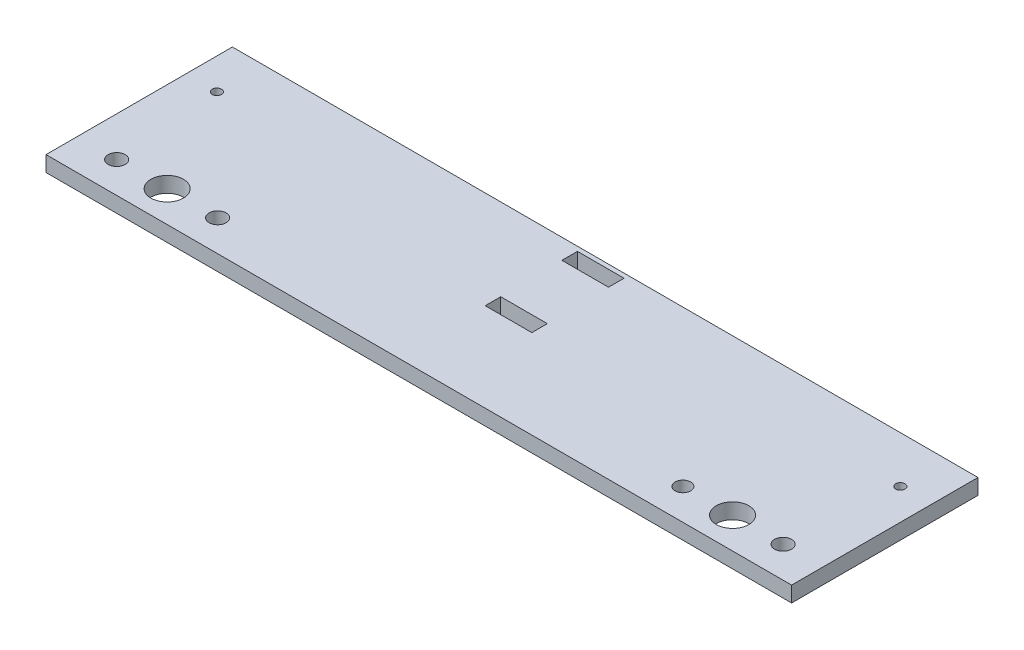
ISO-10303-21;
HEADER;
FILE_DESCRIPTION(('STEP AP214'),'2;1');
FILE_NAME('part.step','',(''),(''),'','','');
FILE_SCHEMA(('AUTOMOTIVE_DESIGN { 1 0 10303 214 1 1 1 1 }'));
ENDSEC;
DATA;
#1=APPLICATION_CONTEXT('core data for automotive mechanical design processes');
#2=APPLICATION_PROTOCOL_DEFINITION('international standard','automotive_design',2000,#1);
#3=PRODUCT_CONTEXT('',#1,'mechanical');
#4=PRODUCT('Part','Part','',(#3));
#5=PRODUCT_RELATED_PRODUCT_CATEGORY('part','',(#4));
#6=PRODUCT_DEFINITION_FORMATION('','',#4);
#7=PRODUCT_DEFINITION_CONTEXT('part definition',#1,'design');
#8=PRODUCT_DEFINITION('design','',#6,#7);
#9=PRODUCT_DEFINITION_SHAPE('','',#8);
#10=(LENGTH_UNIT() NAMED_UNIT(*) SI_UNIT(.MILLI.,.METRE.));
#11=(NAMED_UNIT(*) PLANE_ANGLE_UNIT() SI_UNIT($,.RADIAN.));
#12=(NAMED_UNIT(*) SI_UNIT($,.STERADIAN.) SOLID_ANGLE_UNIT());
#13=UNCERTAINTY_MEASURE_WITH_UNIT(LENGTH_MEASURE(1.E-05),#10,'distance_accuracy_value','');
#14=(GEOMETRIC_REPRESENTATION_CONTEXT(3) GLOBAL_UNCERTAINTY_ASSIGNED_CONTEXT((#13)) GLOBAL_UNIT_ASSIGNED_CONTEXT((#10,
#11,#12)) REPRESENTATION_CONTEXT('',''));
#15=CARTESIAN_POINT('',(0.,0.,0.));
#16=DIRECTION('',(0.,0.,1.));
#17=DIRECTION('',(1.,0.,0.));
#18=AXIS2_PLACEMENT_3D('',#15,#16,#17);
#19=CARTESIAN_POINT('',(0.,5.,0.));
#20=DIRECTION('',(0.,-1.,0.));
#21=DIRECTION('',(0.,0.,-1.));
#22=AXIS2_PLACEMENT_3D('',#19,#20,#21);
#23=PLANE('',#22);
#24=DIRECTION('',(0.,0.,1.));
#25=VECTOR('',#24,1.);
#26=CARTESIAN_POINT('',(-7.49999999999999,5.,-8.3520943961364));
#27=LINE('',#26,#25);
#28=CARTESIAN_POINT('',(-7.49999999999999,5.,-13.3520943961364));
#29=VERTEX_POINT('',#28);
#30=CARTESIAN_POINT('',(-7.49999999999999,5.,-8.3520943961364));
#31=VERTEX_POINT('',#30);
#32=EDGE_CURVE('E161',#29,#31,#27,.T.);
#33=ORIENTED_EDGE('',*,*,#32,.F.);
#34=DIRECTION('',(-1.,0.,0.));
#35=VECTOR('',#34,1.);
#36=CARTESIAN_POINT('',(-7.49999999999999,5.,-13.3520943961364));
#37=LINE('',#36,#35);
#38=CARTESIAN_POINT('',(7.50000000000002,5.,-13.3520943961364));
#39=VERTEX_POINT('',#38);
#40=EDGE_CURVE('E169',#39,#29,#37,.T.);
#41=ORIENTED_EDGE('',*,*,#40,.F.);
#42=DIRECTION('',(0.,0.,-1.));
#43=VECTOR('',#42,1.);
#44=CARTESIAN_POINT('',(7.50000000000003,5.,-8.3520943961364));
#45=LINE('',#44,#43);
#46=CARTESIAN_POINT('',(7.50000000000003,5.,-8.3520943961364));
#47=VERTEX_POINT('',#46);
#48=EDGE_CURVE('E166',#47,#39,#45,.T.);
#49=ORIENTED_EDGE('',*,*,#48,.F.);
#50=DIRECTION('',(1.,0.,0.));
#51=VECTOR('',#50,1.);
#52=CARTESIAN_POINT('',(-7.49999999999999,5.,-8.3520943961364));
#53=LINE('',#52,#51);
#54=EDGE_CURVE('E163',#31,#47,#53,.T.);
#55=ORIENTED_EDGE('',*,*,#54,.F.);
#56=EDGE_LOOP('',(#33,#41,#49,#55));
#57=FACE_BOUND('',#56,.T.);
#58=DIRECTION('',(0.,0.,-1.));
#59=VECTOR('',#58,1.);
#60=CARTESIAN_POINT('',(120.,5.,45.2146363217798));
#61=LINE('',#60,#59);
#62=CARTESIAN_POINT('',(120.,5.,45.2146363217798));
#63=VERTEX_POINT('',#62);
#64=CARTESIAN_POINT('',(120.,5.,-14.7853636782202));
#65=VERTEX_POINT('',#64);
#66=EDGE_CURVE('E204',#63,#65,#61,.T.);
#67=ORIENTED_EDGE('',*,*,#66,.T.);
#68=DIRECTION('',(-1.,0.,0.));
#69=VECTOR('',#68,1.);
#70=CARTESIAN_POINT('',(-120.,5.,-14.7853636782202));
#71=LINE('',#70,#69);
#72=CARTESIAN_POINT('',(-120.,5.,-14.7853636782202));
#73=VERTEX_POINT('',#72);
#74=EDGE_CURVE('E207',#65,#73,#71,.T.);
#75=ORIENTED_EDGE('',*,*,#74,.T.);
#76=DIRECTION('',(0.,0.,1.));
#77=VECTOR('',#76,1.);
#78=CARTESIAN_POINT('',(-120.,5.,45.2146363217798));
#79=LINE('',#78,#77);
#80=CARTESIAN_POINT('',(-120.,5.,45.2146363217798));
#81=VERTEX_POINT('',#80);
#82=EDGE_CURVE('E210',#73,#81,#79,.T.);
#83=ORIENTED_EDGE('',*,*,#82,.T.);
#84=DIRECTION('',(1.,0.,0.));
#85=VECTOR('',#84,1.);
#86=CARTESIAN_POINT('',(-120.,5.,45.2146363217798));
#87=LINE('',#86,#85);
#88=EDGE_CURVE('E212',#81,#63,#87,.T.);
#89=ORIENTED_EDGE('',*,*,#88,.T.);
#90=EDGE_LOOP('',(#67,#75,#83,#89));
#91=FACE_BOUND('',#90,.T.);
#92=CARTESIAN_POINT('',(-91.,5.,35.2146363217798));
#93=DIRECTION('',(0.,1.,0.));
#94=DIRECTION('',(0.,0.,1.));
#95=AXIS2_PLACEMENT_3D('',#92,#93,#94);
#96=CIRCLE('',#95,5.24824810373758);
#97=CARTESIAN_POINT('',(-91.,5.,40.4628844255174));
#98=VERTEX_POINT('',#97);
#99=EDGE_CURVE('E198',#98,#98,#96,.T.);
#100=ORIENTED_EDGE('',*,*,#99,.F.);
#101=EDGE_LOOP('',(#100));
#102=FACE_BOUND('',#101,.T.);
#103=CARTESIAN_POINT('',(91.,5.,35.2146363217798));
#104=DIRECTION('',(0.,1.,0.));
#105=DIRECTION('',(0.,0.,-1.));
#106=AXIS2_PLACEMENT_3D('',#103,#104,#105);
#107=CIRCLE('',#106,5.24824810373758);
#108=CARTESIAN_POINT('',(91.,5.,29.9663882180422));
#109=VERTEX_POINT('',#108);
#110=EDGE_CURVE('E192',#109,#109,#107,.T.);
#111=ORIENTED_EDGE('',*,*,#110,.F.);
#112=EDGE_LOOP('',(#111));
#113=FACE_BOUND('',#112,.T.);
#114=DIRECTION('',(0.,0.,1.));
#115=VECTOR('',#114,1.);
#116=CARTESIAN_POINT('',(-7.18930836329239,5.,16.6479056038636));
#117=LINE('',#116,#115);
#118=CARTESIAN_POINT('',(-7.18930836329239,5.,11.6479056038636));
#119=VERTEX_POINT('',#118);
#120=CARTESIAN_POINT('',(-7.18930836329239,5.,16.6479056038636));
#121=VERTEX_POINT('',#120);
#122=EDGE_CURVE('E122',#119,#121,#117,.T.);
#123=ORIENTED_EDGE('',*,*,#122,.F.);
#124=DIRECTION('',(-1.,0.,0.));
#125=VECTOR('',#124,1.);
#126=CARTESIAN_POINT('',(-7.18930836329239,5.,11.6479056038636));
#127=LINE('',#126,#125);
#128=CARTESIAN_POINT('',(7.81069163670761,5.,11.6479056038636));
#129=VERTEX_POINT('',#128);
#130=EDGE_CURVE('E145',#129,#119,#127,.T.);
#131=ORIENTED_EDGE('',*,*,#130,.F.);
#132=DIRECTION('',(0.,0.,-1.));
#133=VECTOR('',#132,1.);
#134=CARTESIAN_POINT('',(7.81069163670761,5.,16.6479056038636));
#135=LINE('',#134,#133);
#136=CARTESIAN_POINT('',(7.81069163670761,5.,16.6479056038636));
#137=VERTEX_POINT('',#136);
#138=EDGE_CURVE('E143',#137,#129,#135,.T.);
#139=ORIENTED_EDGE('',*,*,#138,.F.);
#140=DIRECTION('',(1.,0.,0.));
#141=VECTOR('',#140,1.);
#142=CARTESIAN_POINT('',(-7.18930836329239,5.,16.6479056038636));
#143=LINE('',#142,#141);
#144=EDGE_CURVE('E130',#121,#137,#143,.T.);
#145=ORIENTED_EDGE('',*,*,#144,.F.);
#146=EDGE_LOOP('',(#123,#131,#139,#145));
#147=FACE_BOUND('',#146,.T.);
#148=CARTESIAN_POINT('',(-110.,5.,0.214636321782202));
#149=DIRECTION('',(0.,1.,0.));
#150=DIRECTION('',(0.,0.,1.));
#151=AXIS2_PLACEMENT_3D('',#148,#149,#150);
#152=CIRCLE('',#151,1.5);
#153=CARTESIAN_POINT('',(-110.,5.,1.7146363217822));
#154=VERTEX_POINT('',#153);
#155=EDGE_CURVE('E151',#154,#154,#152,.T.);
#156=ORIENTED_EDGE('',*,*,#155,.F.);
#157=EDGE_LOOP('',(#156));
#158=FACE_BOUND('',#157,.T.);
#159=CARTESIAN_POINT('',(110.,5.,0.214636321782063));
#160=DIRECTION('',(0.,1.,0.));
#161=DIRECTION('',(0.,0.,1.));
#162=AXIS2_PLACEMENT_3D('',#159,#160,#161);
#163=CIRCLE('',#162,1.5);
#164=CARTESIAN_POINT('',(110.,5.,1.71463632178206));
#165=VERTEX_POINT('',#164);
#166=EDGE_CURVE('E324',#165,#165,#163,.T.);
#167=ORIENTED_EDGE('',*,*,#166,.F.);
#168=EDGE_LOOP('',(#167));
#169=FACE_BOUND('',#168,.T.);
#170=CARTESIAN_POINT('',(-74.7500000000001,5.,35.2146363217771));
#171=DIRECTION('',(0.,1.,0.));
#172=DIRECTION('',(0.,0.,1.));
#173=AXIS2_PLACEMENT_3D('',#170,#171,#172);
#174=CIRCLE('',#173,2.75000000000001);
#175=CARTESIAN_POINT('',(-74.7500000000001,5.,37.9646363217771));
#176=VERTEX_POINT('',#175);
#177=EDGE_CURVE('E319',#176,#176,#174,.T.);
#178=ORIENTED_EDGE('',*,*,#177,.F.);
#179=EDGE_LOOP('',(#178));
#180=FACE_BOUND('',#179,.T.);
#181=CARTESIAN_POINT('',(-107.25,5.,35.2146363217773));
#182=DIRECTION('',(0.,1.,0.));
#183=DIRECTION('',(0.,0.,1.));
#184=AXIS2_PLACEMENT_3D('',#181,#182,#183);
#185=CIRCLE('',#184,2.74999999999999);
#186=CARTESIAN_POINT('',(-107.25,5.,37.9646363217773));
#187=VERTEX_POINT('',#186);
#188=EDGE_CURVE('E314',#187,#187,#185,.T.);
#189=ORIENTED_EDGE('',*,*,#188,.F.);
#190=EDGE_LOOP('',(#189));
#191=FACE_BOUND('',#190,.T.);
#192=CARTESIAN_POINT('',(107.25,5.,35.2146363217773));
#193=DIRECTION('',(0.,1.,0.));
#194=DIRECTION('',(0.,0.,1.));
#195=AXIS2_PLACEMENT_3D('',#192,#193,#194);
#196=CIRCLE('',#195,2.75000000000001);
#197=CARTESIAN_POINT('',(107.25,5.,37.9646363217773));
#198=VERTEX_POINT('',#197);
#199=EDGE_CURVE('E309',#198,#198,#196,.T.);
#200=ORIENTED_EDGE('',*,*,#199,.F.);
#201=EDGE_LOOP('',(#200));
#202=FACE_BOUND('',#201,.T.);
#203=CARTESIAN_POINT('',(75.0000000000001,5.,35.2146363217798));
#204=DIRECTION('',(0.,1.,0.));
#205=DIRECTION('',(0.,0.,1.));
#206=AXIS2_PLACEMENT_3D('',#203,#204,#205);
#207=CIRCLE('',#206,2.49999999999981);
#208=CARTESIAN_POINT('',(75.0000000000001,5.,37.7146363217796));
#209=VERTEX_POINT('',#208);
#210=EDGE_CURVE('E303',#209,#209,#207,.T.);
#211=ORIENTED_EDGE('',*,*,#210,.F.);
#212=EDGE_LOOP('',(#211));
#213=FACE_BOUND('',#212,.T.);
#214=ADVANCED_FACE('F33',(#57,#91,#102,#113,#147,#158,#169,#180,#191,#202,#213),#23,.F.);
#215=CARTESIAN_POINT('',(0.,0.,0.));
#216=DIRECTION('',(0.,-1.,0.));
#217=DIRECTION('',(0.,0.,-1.));
#218=AXIS2_PLACEMENT_3D('',#215,#216,#217);
#219=PLANE('',#218);
#220=CARTESIAN_POINT('',(107.25,0.,35.2146363217773));
#221=DIRECTION('',(0.,1.,0.));
#222=DIRECTION('',(0.,0.,1.));
#223=AXIS2_PLACEMENT_3D('',#220,#221,#222);
#224=CIRCLE('',#223,2.75000000000001);
#225=CARTESIAN_POINT('',(107.25,0.,37.9646363217773));
#226=VERTEX_POINT('',#225);
#227=EDGE_CURVE('E306',#226,#226,#224,.T.);
#228=ORIENTED_EDGE('',*,*,#227,.T.);
#229=EDGE_LOOP('',(#228));
#230=FACE_BOUND('',#229,.T.);
#231=CARTESIAN_POINT('',(-74.7500000000001,0.,35.2146363217771));
#232=DIRECTION('',(0.,1.,0.));
#233=DIRECTION('',(0.,0.,1.));
#234=AXIS2_PLACEMENT_3D('',#231,#232,#233);
#235=CIRCLE('',#234,2.75000000000001);
#236=CARTESIAN_POINT('',(-74.7500000000001,0.,37.9646363217771));
#237=VERTEX_POINT('',#236);
#238=EDGE_CURVE('E317',#237,#237,#235,.T.);
#239=ORIENTED_EDGE('',*,*,#238,.T.);
#240=EDGE_LOOP('',(#239));
#241=FACE_BOUND('',#240,.T.);
#242=CARTESIAN_POINT('',(-110.,0.,0.214636321782202));
#243=DIRECTION('',(0.,1.,0.));
#244=DIRECTION('',(0.,0.,1.));
#245=AXIS2_PLACEMENT_3D('',#242,#243,#244);
#246=CIRCLE('',#245,1.5);
#247=CARTESIAN_POINT('',(-110.,0.,1.7146363217822));
#248=VERTEX_POINT('',#247);
#249=EDGE_CURVE('E327',#248,#248,#246,.T.);
#250=ORIENTED_EDGE('',*,*,#249,.T.);
#251=EDGE_LOOP('',(#250));
#252=FACE_BOUND('',#251,.T.);
#253=CARTESIAN_POINT('',(-91.,0.,35.2146363217798));
#254=DIRECTION('',(0.,1.,0.));
#255=DIRECTION('',(0.,0.,1.));
#256=AXIS2_PLACEMENT_3D('',#253,#254,#255);
#257=CIRCLE('',#256,5.24824810373758);
#258=CARTESIAN_POINT('',(-91.,0.,40.4628844255174));
#259=VERTEX_POINT('',#258);
#260=EDGE_CURVE('E195',#259,#259,#257,.T.);
#261=ORIENTED_EDGE('',*,*,#260,.T.);
#262=EDGE_LOOP('',(#261));
#263=FACE_BOUND('',#262,.T.);
#264=DIRECTION('',(0.,0.,-1.));
#265=VECTOR('',#264,1.);
#266=CARTESIAN_POINT('',(120.,0.,45.2146363217798));
#267=LINE('',#266,#265);
#268=CARTESIAN_POINT('',(120.,0.,45.2146363217798));
#269=VERTEX_POINT('',#268);
#270=CARTESIAN_POINT('',(120.,0.,-14.7853636782202));
#271=VERTEX_POINT('',#270);
#272=EDGE_CURVE('E201',#269,#271,#267,.T.);
#273=ORIENTED_EDGE('',*,*,#272,.F.);
#274=DIRECTION('',(1.,0.,0.));
#275=VECTOR('',#274,1.);
#276=CARTESIAN_POINT('',(-120.,0.,45.2146363217798));
#277=LINE('',#276,#275);
#278=CARTESIAN_POINT('',(-120.,0.,45.2146363217798));
#279=VERTEX_POINT('',#278);
#280=EDGE_CURVE('E208',#279,#269,#277,.T.);
#281=ORIENTED_EDGE('',*,*,#280,.F.);
#282=DIRECTION('',(0.,0.,1.));
#283=VECTOR('',#282,1.);
#284=CARTESIAN_POINT('',(-120.,0.,45.2146363217798));
#285=LINE('',#284,#283);
#286=CARTESIAN_POINT('',(-120.,0.,-14.7853636782202));
#287=VERTEX_POINT('',#286);
#288=EDGE_CURVE('E219',#287,#279,#285,.T.);
#289=ORIENTED_EDGE('',*,*,#288,.F.);
#290=DIRECTION('',(-1.,0.,0.));
#291=VECTOR('',#290,1.);
#292=CARTESIAN_POINT('',(-120.,0.,-14.7853636782202));
#293=LINE('',#292,#291);
#294=EDGE_CURVE('E217',#271,#287,#293,.T.);
#295=ORIENTED_EDGE('',*,*,#294,.F.);
#296=EDGE_LOOP('',(#273,#281,#289,#295));
#297=FACE_BOUND('',#296,.T.);
#298=CARTESIAN_POINT('',(91.,0.,35.2146363217798));
#299=DIRECTION('',(0.,1.,0.));
#300=DIRECTION('',(0.,0.,-1.));
#301=AXIS2_PLACEMENT_3D('',#298,#299,#300);
#302=CIRCLE('',#301,5.24824810373758);
#303=CARTESIAN_POINT('',(91.,0.,29.9663882180422));
#304=VERTEX_POINT('',#303);
#305=EDGE_CURVE('E191',#304,#304,#302,.T.);
#306=ORIENTED_EDGE('',*,*,#305,.T.);
#307=EDGE_LOOP('',(#306));
#308=FACE_BOUND('',#307,.T.);
#309=DIRECTION('',(-1.,0.,0.));
#310=VECTOR('',#309,1.);
#311=CARTESIAN_POINT('',(-7.49999999999999,0.,-13.3520943961364));
#312=LINE('',#311,#310);
#313=CARTESIAN_POINT('',(7.50000000000002,0.,-13.3520943961364));
#314=VERTEX_POINT('',#313);
#315=CARTESIAN_POINT('',(-7.49999999999999,0.,-13.3520943961364));
#316=VERTEX_POINT('',#315);
#317=EDGE_CURVE('E164',#314,#316,#312,.T.);
#318=ORIENTED_EDGE('',*,*,#317,.T.);
#319=DIRECTION('',(0.,0.,1.));
#320=VECTOR('',#319,1.);
#321=CARTESIAN_POINT('',(-7.49999999999999,0.,-8.3520943961364));
#322=LINE('',#321,#320);
#323=CARTESIAN_POINT('',(-7.49999999999999,0.,-8.3520943961364));
#324=VERTEX_POINT('',#323);
#325=EDGE_CURVE('E138',#316,#324,#322,.T.);
#326=ORIENTED_EDGE('',*,*,#325,.T.);
#327=DIRECTION('',(1.,0.,0.));
#328=VECTOR('',#327,1.);
#329=CARTESIAN_POINT('',(-7.49999999999999,0.,-8.3520943961364));
#330=LINE('',#329,#328);
#331=CARTESIAN_POINT('',(7.50000000000003,0.,-8.3520943961364));
#332=VERTEX_POINT('',#331);
#333=EDGE_CURVE('E174',#324,#332,#330,.T.);
#334=ORIENTED_EDGE('',*,*,#333,.T.);
#335=DIRECTION('',(0.,0.,-1.));
#336=VECTOR('',#335,1.);
#337=CARTESIAN_POINT('',(7.50000000000003,0.,-8.3520943961364));
#338=LINE('',#337,#336);
#339=EDGE_CURVE('E177',#332,#314,#338,.T.);
#340=ORIENTED_EDGE('',*,*,#339,.T.);
#341=EDGE_LOOP('',(#318,#326,#334,#340));
#342=FACE_BOUND('',#341,.T.);
#343=DIRECTION('',(-1.,0.,0.));
#344=VECTOR('',#343,1.);
#345=CARTESIAN_POINT('',(-7.18930836329239,0.,11.6479056038636));
#346=LINE('',#345,#344);
#347=CARTESIAN_POINT('',(7.81069163670761,0.,11.6479056038636));
#348=VERTEX_POINT('',#347);
#349=CARTESIAN_POINT('',(-7.18930836329239,0.,11.6479056038636));
#350=VERTEX_POINT('',#349);
#351=EDGE_CURVE('E131',#348,#350,#346,.T.);
#352=ORIENTED_EDGE('',*,*,#351,.T.);
#353=DIRECTION('',(0.,0.,1.));
#354=VECTOR('',#353,1.);
#355=CARTESIAN_POINT('',(-7.18930836329239,0.,16.6479056038636));
#356=LINE('',#355,#354);
#357=CARTESIAN_POINT('',(-7.18930836329239,0.,16.6479056038636));
#358=VERTEX_POINT('',#357);
#359=EDGE_CURVE('E56',#350,#358,#356,.T.);
#360=ORIENTED_EDGE('',*,*,#359,.T.);
#361=DIRECTION('',(1.,0.,0.));
#362=VECTOR('',#361,1.);
#363=CARTESIAN_POINT('',(-7.18930836329239,0.,16.6479056038636));
#364=LINE('',#363,#362);
#365=CARTESIAN_POINT('',(7.81069163670761,0.,16.6479056038636));
#366=VERTEX_POINT('',#365);
#367=EDGE_CURVE('E137',#358,#366,#364,.T.);
#368=ORIENTED_EDGE('',*,*,#367,.T.);
#369=DIRECTION('',(0.,0.,-1.));
#370=VECTOR('',#369,1.);
#371=CARTESIAN_POINT('',(7.81069163670761,0.,16.6479056038636));
#372=LINE('',#371,#370);
#373=EDGE_CURVE('E153',#366,#348,#372,.T.);
#374=ORIENTED_EDGE('',*,*,#373,.T.);
#375=EDGE_LOOP('',(#352,#360,#368,#374));
#376=FACE_BOUND('',#375,.T.);
#377=CARTESIAN_POINT('',(110.,0.,0.214636321782063));
#378=DIRECTION('',(0.,1.,0.));
#379=DIRECTION('',(0.,0.,1.));
#380=AXIS2_PLACEMENT_3D('',#377,#378,#379);
#381=CIRCLE('',#380,1.5);
#382=CARTESIAN_POINT('',(110.,0.,1.71463632178206));
#383=VERTEX_POINT('',#382);
#384=EDGE_CURVE('E294',#383,#383,#381,.T.);
#385=ORIENTED_EDGE('',*,*,#384,.T.);
#386=EDGE_LOOP('',(#385));
#387=FACE_BOUND('',#386,.T.);
#388=CARTESIAN_POINT('',(-107.25,0.,35.2146363217773));
#389=DIRECTION('',(0.,1.,0.));
#390=DIRECTION('',(0.,0.,1.));
#391=AXIS2_PLACEMENT_3D('',#388,#389,#390);
#392=CIRCLE('',#391,2.74999999999999);
#393=CARTESIAN_POINT('',(-107.25,0.,37.9646363217773));
#394=VERTEX_POINT('',#393);
#395=EDGE_CURVE('E298',#394,#394,#392,.T.);
#396=ORIENTED_EDGE('',*,*,#395,.T.);
#397=EDGE_LOOP('',(#396));
#398=FACE_BOUND('',#397,.T.);
#399=CARTESIAN_POINT('',(75.0000000000001,0.,35.2146363217798));
#400=DIRECTION('',(0.,1.,0.));
#401=DIRECTION('',(0.,0.,1.));
#402=AXIS2_PLACEMENT_3D('',#399,#400,#401);
#403=CIRCLE('',#402,2.49999999999981);
#404=CARTESIAN_POINT('',(75.0000000000001,0.,37.7146363217796));
#405=VERTEX_POINT('',#404);
#406=EDGE_CURVE('E301',#405,#405,#403,.T.);
#407=ORIENTED_EDGE('',*,*,#406,.T.);
#408=EDGE_LOOP('',(#407));
#409=FACE_BOUND('',#408,.T.);
#410=ADVANCED_FACE('F237',(#230,#241,#252,#263,#297,#308,#342,#376,#387,#398,#409),#219,.T.);
#411=CARTESIAN_POINT('',(120.,5.,45.2146363217798));
#412=DIRECTION('',(-1.,0.,0.));
#413=DIRECTION('',(0.,0.,1.));
#414=AXIS2_PLACEMENT_3D('',#411,#412,#413);
#415=PLANE('',#414);
#416=ORIENTED_EDGE('',*,*,#272,.T.);
#417=DIRECTION('',(0.,-1.,0.));
#418=VECTOR('',#417,1.);
#419=CARTESIAN_POINT('',(120.,5.,-14.7853636782202));
#420=LINE('',#419,#418);
#421=EDGE_CURVE('E11',#65,#271,#420,.T.);
#422=ORIENTED_EDGE('',*,*,#421,.F.);
#423=ORIENTED_EDGE('',*,*,#66,.F.);
#424=DIRECTION('',(0.,-1.,0.));
#425=VECTOR('',#424,1.);
#426=CARTESIAN_POINT('',(120.,5.,45.2146363217798));
#427=LINE('',#426,#425);
#428=EDGE_CURVE('E214',#63,#269,#427,.T.);
#429=ORIENTED_EDGE('',*,*,#428,.T.);
#430=EDGE_LOOP('',(#416,#422,#423,#429));
#431=FACE_BOUND('',#430,.T.);
#432=ADVANCED_FACE('F35',(#431),#415,.F.);
#433=CARTESIAN_POINT('',(-120.,5.,-14.7853636782202));
#434=DIRECTION('',(0.,0.,1.));
#435=DIRECTION('',(1.,0.,0.));
#436=AXIS2_PLACEMENT_3D('',#433,#434,#435);
#437=PLANE('',#436);
#438=ORIENTED_EDGE('',*,*,#294,.T.);
#439=DIRECTION('',(0.,-1.,0.));
#440=VECTOR('',#439,1.);
#441=CARTESIAN_POINT('',(-120.,5.,-14.7853636782202));
#442=LINE('',#441,#440);
#443=EDGE_CURVE('E41',#73,#287,#442,.T.);
#444=ORIENTED_EDGE('',*,*,#443,.F.);
#445=ORIENTED_EDGE('',*,*,#74,.F.);
#446=ORIENTED_EDGE('',*,*,#421,.T.);
#447=EDGE_LOOP('',(#438,#444,#445,#446));
#448=FACE_BOUND('',#447,.T.);
#449=ADVANCED_FACE('F248',(#448),#437,.F.);
#450=CARTESIAN_POINT('',(-120.,5.,45.2146363217798));
#451=DIRECTION('',(1.,0.,0.));
#452=DIRECTION('',(0.,0.,-1.));
#453=AXIS2_PLACEMENT_3D('',#450,#451,#452);
#454=PLANE('',#453);
#455=ORIENTED_EDGE('',*,*,#288,.T.);
#456=DIRECTION('',(0.,-1.,0.));
#457=VECTOR('',#456,1.);
#458=CARTESIAN_POINT('',(-120.,5.,45.2146363217798));
#459=LINE('',#458,#457);
#460=EDGE_CURVE('E224',#81,#279,#459,.T.);
#461=ORIENTED_EDGE('',*,*,#460,.F.);
#462=ORIENTED_EDGE('',*,*,#82,.F.);
#463=ORIENTED_EDGE('',*,*,#443,.T.);
#464=EDGE_LOOP('',(#455,#461,#462,#463));
#465=FACE_BOUND('',#464,.T.);
#466=ADVANCED_FACE('F231',(#465),#454,.F.);
#467=CARTESIAN_POINT('',(-120.,5.,45.2146363217798));
#468=DIRECTION('',(0.,0.,-1.));
#469=DIRECTION('',(-1.,0.,0.));
#470=AXIS2_PLACEMENT_3D('',#467,#468,#469);
#471=PLANE('',#470);
#472=ORIENTED_EDGE('',*,*,#280,.T.);
#473=ORIENTED_EDGE('',*,*,#428,.F.);
#474=ORIENTED_EDGE('',*,*,#88,.F.);
#475=ORIENTED_EDGE('',*,*,#460,.T.);
#476=EDGE_LOOP('',(#472,#473,#474,#475));
#477=FACE_BOUND('',#476,.T.);
#478=ADVANCED_FACE('F241',(#477),#471,.F.);
#479=CARTESIAN_POINT('',(-91.,5.,35.2146363217798));
#480=DIRECTION('',(0.,-1.,0.));
#481=DIRECTION('',(0.,0.,-1.));
#482=AXIS2_PLACEMENT_3D('',#479,#480,#481);
#483=CYLINDRICAL_SURFACE('',#482,5.24824810373758);
#484=ORIENTED_EDGE('',*,*,#99,.T.);
#485=EDGE_LOOP('',(#484));
#486=FACE_BOUND('',#485,.T.);
#487=ORIENTED_EDGE('',*,*,#260,.F.);
#488=EDGE_LOOP('',(#487));
#489=FACE_BOUND('',#488,.T.);
#490=ADVANCED_FACE('F265',(#486,#489),#483,.F.);
#491=CARTESIAN_POINT('',(91.,5.,35.2146363217798));
#492=DIRECTION('',(0.,-1.,0.));
#493=DIRECTION('',(0.,0.,-1.));
#494=AXIS2_PLACEMENT_3D('',#491,#492,#493);
#495=CYLINDRICAL_SURFACE('',#494,5.24824810373758);
#496=ORIENTED_EDGE('',*,*,#110,.T.);
#497=EDGE_LOOP('',(#496));
#498=FACE_BOUND('',#497,.T.);
#499=ORIENTED_EDGE('',*,*,#305,.F.);
#500=EDGE_LOOP('',(#499));
#501=FACE_BOUND('',#500,.T.);
#502=ADVANCED_FACE('F272',(#498,#501),#495,.F.);
#503=CARTESIAN_POINT('',(-7.49999999999999,5.,-8.3520943961364));
#504=DIRECTION('',(1.,0.,0.));
#505=DIRECTION('',(0.,0.,-1.));
#506=AXIS2_PLACEMENT_3D('',#503,#504,#505);
#507=PLANE('',#506);
#508=ORIENTED_EDGE('',*,*,#325,.F.);
#509=DIRECTION('',(0.,-1.,0.));
#510=VECTOR('',#509,1.);
#511=CARTESIAN_POINT('',(-7.49999999999999,5.,-13.3520943961364));
#512=LINE('',#511,#510);
#513=EDGE_CURVE('E171',#29,#316,#512,.T.);
#514=ORIENTED_EDGE('',*,*,#513,.F.);
#515=ORIENTED_EDGE('',*,*,#32,.T.);
#516=DIRECTION('',(0.,-1.,0.));
#517=VECTOR('',#516,1.);
#518=CARTESIAN_POINT('',(-7.49999999999999,5.,-8.3520943961364));
#519=LINE('',#518,#517);
#520=EDGE_CURVE('E188',#31,#324,#519,.T.);
#521=ORIENTED_EDGE('',*,*,#520,.T.);
#522=EDGE_LOOP('',(#508,#514,#515,#521));
#523=FACE_BOUND('',#522,.T.);
#524=ADVANCED_FACE('F277',(#523),#507,.T.);
#525=CARTESIAN_POINT('',(-7.49999999999999,5.,-8.3520943961364));
#526=DIRECTION('',(0.,0.,-1.));
#527=DIRECTION('',(-1.,0.,0.));
#528=AXIS2_PLACEMENT_3D('',#525,#526,#527);
#529=PLANE('',#528);
#530=ORIENTED_EDGE('',*,*,#333,.F.);
#531=ORIENTED_EDGE('',*,*,#520,.F.);
#532=ORIENTED_EDGE('',*,*,#54,.T.);
#533=DIRECTION('',(0.,-1.,0.));
#534=VECTOR('',#533,1.);
#535=CARTESIAN_POINT('',(7.50000000000003,5.,-8.3520943961364));
#536=LINE('',#535,#534);
#537=EDGE_CURVE('E186',#47,#332,#536,.T.);
#538=ORIENTED_EDGE('',*,*,#537,.T.);
#539=EDGE_LOOP('',(#530,#531,#532,#538));
#540=FACE_BOUND('',#539,.T.);
#541=ADVANCED_FACE('F365',(#540),#529,.T.);
#542=CARTESIAN_POINT('',(7.50000000000003,5.,-8.3520943961364));
#543=DIRECTION('',(-1.,0.,0.));
#544=DIRECTION('',(0.,0.,1.));
#545=AXIS2_PLACEMENT_3D('',#542,#543,#544);
#546=PLANE('',#545);
#547=ORIENTED_EDGE('',*,*,#339,.F.);
#548=ORIENTED_EDGE('',*,*,#537,.F.);
#549=ORIENTED_EDGE('',*,*,#48,.T.);
#550=DIRECTION('',(0.,-1.,0.));
#551=VECTOR('',#550,1.);
#552=CARTESIAN_POINT('',(7.50000000000002,5.,-13.3520943961364));
#553=LINE('',#552,#551);
#554=EDGE_CURVE('E184',#39,#314,#553,.T.);
#555=ORIENTED_EDGE('',*,*,#554,.T.);
#556=EDGE_LOOP('',(#547,#548,#549,#555));
#557=FACE_BOUND('',#556,.T.);
#558=ADVANCED_FACE('F361',(#557),#546,.T.);
#559=CARTESIAN_POINT('',(-7.49999999999999,5.,-13.3520943961364));
#560=DIRECTION('',(0.,0.,1.));
#561=DIRECTION('',(1.,0.,0.));
#562=AXIS2_PLACEMENT_3D('',#559,#560,#561);
#563=PLANE('',#562);
#564=ORIENTED_EDGE('',*,*,#317,.F.);
#565=ORIENTED_EDGE('',*,*,#554,.F.);
#566=ORIENTED_EDGE('',*,*,#40,.T.);
#567=ORIENTED_EDGE('',*,*,#513,.T.);
#568=EDGE_LOOP('',(#564,#565,#566,#567));
#569=FACE_BOUND('',#568,.T.);
#570=ADVANCED_FACE('F358',(#569),#563,.T.);
#571=CARTESIAN_POINT('',(-7.18930836329239,5.,16.6479056038636));
#572=DIRECTION('',(1.,0.,0.));
#573=DIRECTION('',(0.,0.,-1.));
#574=AXIS2_PLACEMENT_3D('',#571,#572,#573);
#575=PLANE('',#574);
#576=ORIENTED_EDGE('',*,*,#359,.F.);
#577=DIRECTION('',(0.,-1.,0.));
#578=VECTOR('',#577,1.);
#579=CARTESIAN_POINT('',(-7.18930836329239,5.,11.6479056038636));
#580=LINE('',#579,#578);
#581=EDGE_CURVE('E126',#119,#350,#580,.T.);
#582=ORIENTED_EDGE('',*,*,#581,.F.);
#583=ORIENTED_EDGE('',*,*,#122,.T.);
#584=DIRECTION('',(0.,-1.,0.));
#585=VECTOR('',#584,1.);
#586=CARTESIAN_POINT('',(-7.18930836329239,5.,16.6479056038636));
#587=LINE('',#586,#585);
#588=EDGE_CURVE('E125',#121,#358,#587,.T.);
#589=ORIENTED_EDGE('',*,*,#588,.T.);
#590=EDGE_LOOP('',(#576,#582,#583,#589));
#591=FACE_BOUND('',#590,.T.);
#592=ADVANCED_FACE('F124',(#591),#575,.T.);
#593=CARTESIAN_POINT('',(-7.18930836329239,5.,16.6479056038636));
#594=DIRECTION('',(0.,0.,-1.));
#595=DIRECTION('',(-1.,0.,0.));
#596=AXIS2_PLACEMENT_3D('',#593,#594,#595);
#597=PLANE('',#596);
#598=ORIENTED_EDGE('',*,*,#367,.F.);
#599=ORIENTED_EDGE('',*,*,#588,.F.);
#600=ORIENTED_EDGE('',*,*,#144,.T.);
#601=DIRECTION('',(0.,-1.,0.));
#602=VECTOR('',#601,1.);
#603=CARTESIAN_POINT('',(7.81069163670761,5.,16.6479056038636));
#604=LINE('',#603,#602);
#605=EDGE_CURVE('E139',#137,#366,#604,.T.);
#606=ORIENTED_EDGE('',*,*,#605,.T.);
#607=EDGE_LOOP('',(#598,#599,#600,#606));
#608=FACE_BOUND('',#607,.T.);
#609=ADVANCED_FACE('F134',(#608),#597,.T.);
#610=CARTESIAN_POINT('',(7.81069163670761,5.,16.6479056038636));
#611=DIRECTION('',(-1.,0.,0.));
#612=DIRECTION('',(0.,0.,1.));
#613=AXIS2_PLACEMENT_3D('',#610,#611,#612);
#614=PLANE('',#613);
#615=ORIENTED_EDGE('',*,*,#373,.F.);
#616=ORIENTED_EDGE('',*,*,#605,.F.);
#617=ORIENTED_EDGE('',*,*,#138,.T.);
#618=DIRECTION('',(0.,-1.,0.));
#619=VECTOR('',#618,1.);
#620=CARTESIAN_POINT('',(7.81069163670761,5.,11.6479056038636));
#621=LINE('',#620,#619);
#622=EDGE_CURVE('E48',#129,#348,#621,.T.);
#623=ORIENTED_EDGE('',*,*,#622,.T.);
#624=EDGE_LOOP('',(#615,#616,#617,#623));
#625=FACE_BOUND('',#624,.T.);
#626=ADVANCED_FACE('F347',(#625),#614,.T.);
#627=CARTESIAN_POINT('',(-7.18930836329239,5.,11.6479056038636));
#628=DIRECTION('',(0.,0.,1.));
#629=DIRECTION('',(1.,0.,0.));
#630=AXIS2_PLACEMENT_3D('',#627,#628,#629);
#631=PLANE('',#630);
#632=ORIENTED_EDGE('',*,*,#351,.F.);
#633=ORIENTED_EDGE('',*,*,#622,.F.);
#634=ORIENTED_EDGE('',*,*,#130,.T.);
#635=ORIENTED_EDGE('',*,*,#581,.T.);
#636=EDGE_LOOP('',(#632,#633,#634,#635));
#637=FACE_BOUND('',#636,.T.);
#638=ADVANCED_FACE('F337',(#637),#631,.T.);
#639=CARTESIAN_POINT('',(-110.,5.,0.214636321782202));
#640=DIRECTION('',(0.,-1.,0.));
#641=DIRECTION('',(0.,0.,-1.));
#642=AXIS2_PLACEMENT_3D('',#639,#640,#641);
#643=CYLINDRICAL_SURFACE('',#642,1.5);
#644=ORIENTED_EDGE('',*,*,#155,.T.);
#645=EDGE_LOOP('',(#644));
#646=FACE_BOUND('',#645,.T.);
#647=ORIENTED_EDGE('',*,*,#249,.F.);
#648=EDGE_LOOP('',(#647));
#649=FACE_BOUND('',#648,.T.);
#650=ADVANCED_FACE('F334',(#646,#649),#643,.F.);
#651=CARTESIAN_POINT('',(110.,5.,0.214636321782063));
#652=DIRECTION('',(0.,-1.,0.));
#653=DIRECTION('',(0.,0.,-1.));
#654=AXIS2_PLACEMENT_3D('',#651,#652,#653);
#655=CYLINDRICAL_SURFACE('',#654,1.5);
#656=ORIENTED_EDGE('',*,*,#166,.T.);
#657=EDGE_LOOP('',(#656));
#658=FACE_BOUND('',#657,.T.);
#659=ORIENTED_EDGE('',*,*,#384,.F.);
#660=EDGE_LOOP('',(#659));
#661=FACE_BOUND('',#660,.T.);
#662=ADVANCED_FACE('F336',(#658,#661),#655,.F.);
#663=CARTESIAN_POINT('',(-74.7500000000001,5.,35.2146363217771));
#664=DIRECTION('',(0.,-1.,0.));
#665=DIRECTION('',(0.,0.,-1.));
#666=AXIS2_PLACEMENT_3D('',#663,#664,#665);
#667=CYLINDRICAL_SURFACE('',#666,2.75000000000001);
#668=ORIENTED_EDGE('',*,*,#177,.T.);
#669=EDGE_LOOP('',(#668));
#670=FACE_BOUND('',#669,.T.);
#671=ORIENTED_EDGE('',*,*,#238,.F.);
#672=EDGE_LOOP('',(#671));
#673=FACE_BOUND('',#672,.T.);
#674=ADVANCED_FACE('F344',(#670,#673),#667,.F.);
#675=CARTESIAN_POINT('',(-107.25,5.,35.2146363217773));
#676=DIRECTION('',(0.,-1.,0.));
#677=DIRECTION('',(0.,0.,-1.));
#678=AXIS2_PLACEMENT_3D('',#675,#676,#677);
#679=CYLINDRICAL_SURFACE('',#678,2.74999999999999);
#680=ORIENTED_EDGE('',*,*,#188,.T.);
#681=EDGE_LOOP('',(#680));
#682=FACE_BOUND('',#681,.T.);
#683=ORIENTED_EDGE('',*,*,#395,.F.);
#684=EDGE_LOOP('',(#683));
#685=FACE_BOUND('',#684,.T.);
#686=ADVANCED_FACE('F430',(#682,#685),#679,.F.);
#687=CARTESIAN_POINT('',(107.25,5.,35.2146363217773));
#688=DIRECTION('',(0.,-1.,0.));
#689=DIRECTION('',(0.,0.,-1.));
#690=AXIS2_PLACEMENT_3D('',#687,#688,#689);
#691=CYLINDRICAL_SURFACE('',#690,2.75000000000001);
#692=ORIENTED_EDGE('',*,*,#199,.T.);
#693=EDGE_LOOP('',(#692));
#694=FACE_BOUND('',#693,.T.);
#695=ORIENTED_EDGE('',*,*,#227,.F.);
#696=EDGE_LOOP('',(#695));
#697=FACE_BOUND('',#696,.T.);
#698=ADVANCED_FACE('F439',(#694,#697),#691,.F.);
#699=CARTESIAN_POINT('',(75.0000000000001,5.,35.2146363217798));
#700=DIRECTION('',(0.,-1.,0.));
#701=DIRECTION('',(0.,0.,-1.));
#702=AXIS2_PLACEMENT_3D('',#699,#700,#701);
#703=CYLINDRICAL_SURFACE('',#702,2.49999999999981);
#704=ORIENTED_EDGE('',*,*,#210,.T.);
#705=EDGE_LOOP('',(#704));
#706=FACE_BOUND('',#705,.T.);
#707=ORIENTED_EDGE('',*,*,#406,.F.);
#708=EDGE_LOOP('',(#707));
#709=FACE_BOUND('',#708,.T.);
#710=ADVANCED_FACE('F449',(#706,#709),#703,.F.);
#711=CLOSED_SHELL('',(#214,#410,#432,#449,#466,#478,#490,#502,#524,#541,#558,#570,#592,#609,
#626,#638,#650,#662,#674,#686,#698,#710));
#712=MANIFOLD_SOLID_BREP('B2',#711);
#713=ADVANCED_BREP_SHAPE_REPRESENTATION('',(#18,#712),#14);
#714=SHAPE_DEFINITION_REPRESENTATION(#9,#713);
ENDSEC;
END-ISO-10303-21;
